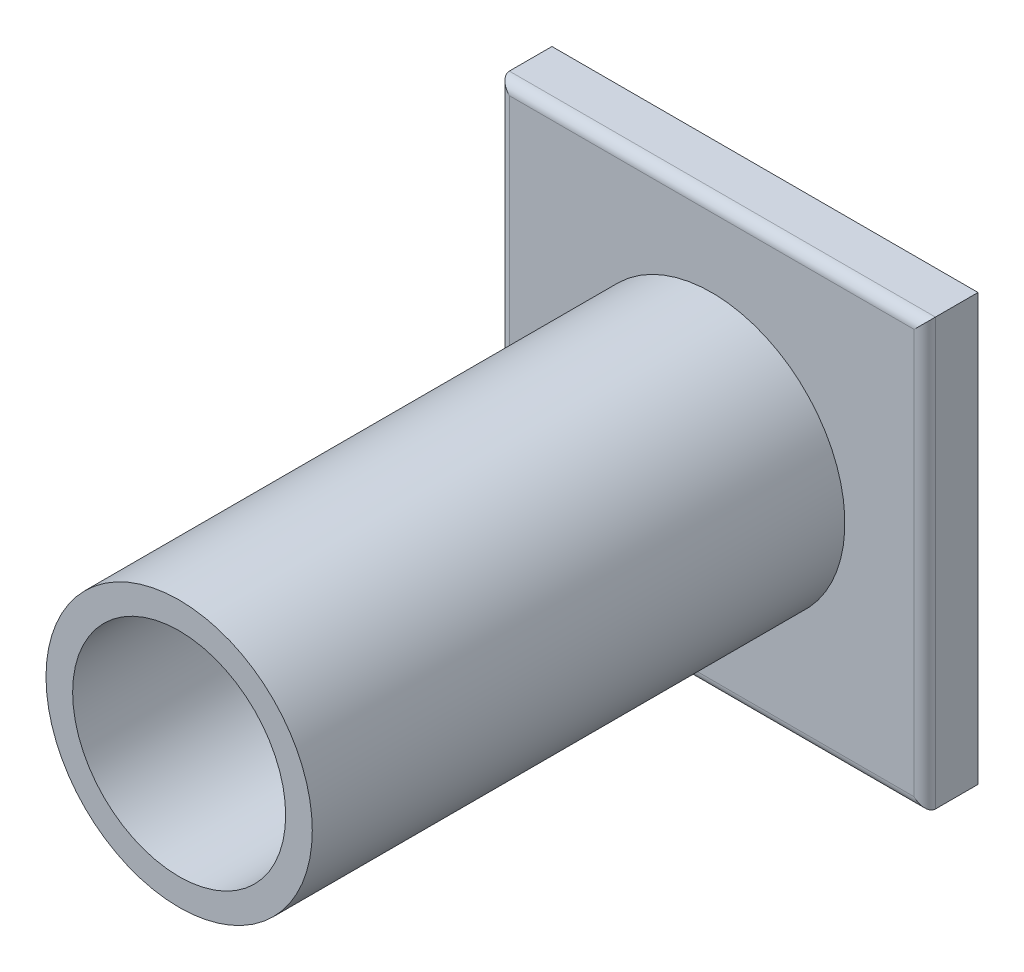
ISO-10303-21;
HEADER;
FILE_DESCRIPTION(('STEP AP214'),'2;1');
FILE_NAME('part.step','',(''),(''),'','','');
FILE_SCHEMA(('AUTOMOTIVE_DESIGN { 1 0 10303 214 1 1 1 1 }'));
ENDSEC;
DATA;
#1=APPLICATION_CONTEXT('core data for automotive mechanical design processes');
#2=APPLICATION_PROTOCOL_DEFINITION('international standard','automotive_design',2000,#1);
#3=PRODUCT_CONTEXT('',#1,'mechanical');
#4=PRODUCT('Part','Part','',(#3));
#5=PRODUCT_RELATED_PRODUCT_CATEGORY('part','',(#4));
#6=PRODUCT_DEFINITION_FORMATION('','',#4);
#7=PRODUCT_DEFINITION_CONTEXT('part definition',#1,'design');
#8=PRODUCT_DEFINITION('design','',#6,#7);
#9=PRODUCT_DEFINITION_SHAPE('','',#8);
#10=(LENGTH_UNIT() NAMED_UNIT(*) SI_UNIT(.MILLI.,.METRE.));
#11=(NAMED_UNIT(*) PLANE_ANGLE_UNIT() SI_UNIT($,.RADIAN.));
#12=(NAMED_UNIT(*) SI_UNIT($,.STERADIAN.) SOLID_ANGLE_UNIT());
#13=UNCERTAINTY_MEASURE_WITH_UNIT(LENGTH_MEASURE(1.E-05),#10,'distance_accuracy_value','');
#14=(GEOMETRIC_REPRESENTATION_CONTEXT(3) GLOBAL_UNCERTAINTY_ASSIGNED_CONTEXT((#13)) GLOBAL_UNIT_ASSIGNED_CONTEXT((#10,
#11,#12)) REPRESENTATION_CONTEXT('',''));
#15=CARTESIAN_POINT('',(0.,0.,0.));
#16=DIRECTION('',(0.,0.,1.));
#17=DIRECTION('',(1.,0.,0.));
#18=AXIS2_PLACEMENT_3D('',#15,#16,#17);
#19=CARTESIAN_POINT('',(400.,-400.,100.));
#20=DIRECTION('',(-1.,0.,0.));
#21=DIRECTION('',(0.,0.,1.));
#22=AXIS2_PLACEMENT_3D('',#19,#20,#21);
#23=PLANE('',#22);
#24=DIRECTION('',(0.,0.,-1.));
#25=VECTOR('',#24,1.);
#26=CARTESIAN_POINT('',(400.,400.,100.));
#27=LINE('',#26,#25);
#28=CARTESIAN_POINT('',(400.,400.,80.));
#29=VERTEX_POINT('',#28);
#30=CARTESIAN_POINT('',(400.,400.,0.));
#31=VERTEX_POINT('',#30);
#32=EDGE_CURVE('E103',#29,#31,#27,.T.);
#33=ORIENTED_EDGE('',*,*,#32,.F.);
#34=DIRECTION('',(0.,1.,0.));
#35=VECTOR('',#34,1.);
#36=CARTESIAN_POINT('',(400.,-400.,80.));
#37=LINE('',#36,#35);
#38=CARTESIAN_POINT('',(400.,-400.,80.));
#39=VERTEX_POINT('',#38);
#40=EDGE_CURVE('E59',#29,#39,#37,.F.);
#41=ORIENTED_EDGE('',*,*,#40,.T.);
#42=DIRECTION('',(0.,0.,-1.));
#43=VECTOR('',#42,1.);
#44=CARTESIAN_POINT('',(400.,-400.,100.));
#45=LINE('',#44,#43);
#46=CARTESIAN_POINT('',(400.,-400.,0.));
#47=VERTEX_POINT('',#46);
#48=EDGE_CURVE('E123',#39,#47,#45,.T.);
#49=ORIENTED_EDGE('',*,*,#48,.T.);
#50=DIRECTION('',(0.,1.,0.));
#51=VECTOR('',#50,1.);
#52=CARTESIAN_POINT('',(400.,-400.,0.));
#53=LINE('',#52,#51);
#54=EDGE_CURVE('E119',#47,#31,#53,.T.);
#55=ORIENTED_EDGE('',*,*,#54,.T.);
#56=EDGE_LOOP('',(#33,#41,#49,#55));
#57=FACE_BOUND('',#56,.T.);
#58=ADVANCED_FACE('F50',(#57),#23,.F.);
#59=CARTESIAN_POINT('',(-400.,400.,100.));
#60=DIRECTION('',(0.,-1.,0.));
#61=DIRECTION('',(0.,0.,-1.));
#62=AXIS2_PLACEMENT_3D('',#59,#60,#61);
#63=PLANE('',#62);
#64=DIRECTION('',(0.,0.,-1.));
#65=VECTOR('',#64,1.);
#66=CARTESIAN_POINT('',(-400.,400.,100.));
#67=LINE('',#66,#65);
#68=CARTESIAN_POINT('',(-400.,400.,80.));
#69=VERTEX_POINT('',#68);
#70=CARTESIAN_POINT('',(-400.,400.,0.));
#71=VERTEX_POINT('',#70);
#72=EDGE_CURVE('E113',#69,#71,#67,.T.);
#73=ORIENTED_EDGE('',*,*,#72,.F.);
#74=DIRECTION('',(-1.,0.,0.));
#75=VECTOR('',#74,1.);
#76=CARTESIAN_POINT('',(-400.,400.,80.));
#77=LINE('',#76,#75);
#78=EDGE_CURVE('E110',#69,#29,#77,.F.);
#79=ORIENTED_EDGE('',*,*,#78,.T.);
#80=ORIENTED_EDGE('',*,*,#32,.T.);
#81=DIRECTION('',(-1.,0.,0.));
#82=VECTOR('',#81,1.);
#83=CARTESIAN_POINT('',(-400.,400.,0.));
#84=LINE('',#83,#82);
#85=EDGE_CURVE('E107',#31,#71,#84,.T.);
#86=ORIENTED_EDGE('',*,*,#85,.T.);
#87=EDGE_LOOP('',(#73,#79,#80,#86));
#88=FACE_BOUND('',#87,.T.);
#89=ADVANCED_FACE('F106',(#88),#63,.F.);
#90=CARTESIAN_POINT('',(-400.,-400.,100.));
#91=DIRECTION('',(1.,0.,0.));
#92=DIRECTION('',(0.,0.,-1.));
#93=AXIS2_PLACEMENT_3D('',#90,#91,#92);
#94=PLANE('',#93);
#95=DIRECTION('',(0.,0.,-1.));
#96=VECTOR('',#95,1.);
#97=CARTESIAN_POINT('',(-400.,-400.,100.));
#98=LINE('',#97,#96);
#99=CARTESIAN_POINT('',(-400.,-400.,80.));
#100=VERTEX_POINT('',#99);
#101=CARTESIAN_POINT('',(-400.,-400.,0.));
#102=VERTEX_POINT('',#101);
#103=EDGE_CURVE('E136',#100,#102,#98,.T.);
#104=ORIENTED_EDGE('',*,*,#103,.F.);
#105=DIRECTION('',(0.,-1.,0.));
#106=VECTOR('',#105,1.);
#107=CARTESIAN_POINT('',(-400.,-400.,80.));
#108=LINE('',#107,#106);
#109=EDGE_CURVE('E151',#100,#69,#108,.F.);
#110=ORIENTED_EDGE('',*,*,#109,.T.);
#111=ORIENTED_EDGE('',*,*,#72,.T.);
#112=DIRECTION('',(0.,-1.,0.));
#113=VECTOR('',#112,1.);
#114=CARTESIAN_POINT('',(-400.,-400.,0.));
#115=LINE('',#114,#113);
#116=EDGE_CURVE('E121',#71,#102,#115,.T.);
#117=ORIENTED_EDGE('',*,*,#116,.T.);
#118=EDGE_LOOP('',(#104,#110,#111,#117));
#119=FACE_BOUND('',#118,.T.);
#120=ADVANCED_FACE('F197',(#119),#94,.F.);
#121=CARTESIAN_POINT('',(-400.,-400.,100.));
#122=DIRECTION('',(0.,1.,0.));
#123=DIRECTION('',(0.,0.,1.));
#124=AXIS2_PLACEMENT_3D('',#121,#122,#123);
#125=PLANE('',#124);
#126=ORIENTED_EDGE('',*,*,#48,.F.);
#127=DIRECTION('',(1.,0.,0.));
#128=VECTOR('',#127,1.);
#129=CARTESIAN_POINT('',(-400.,-400.,80.));
#130=LINE('',#129,#128);
#131=EDGE_CURVE('E11',#39,#100,#130,.F.);
#132=ORIENTED_EDGE('',*,*,#131,.T.);
#133=ORIENTED_EDGE('',*,*,#103,.T.);
#134=DIRECTION('',(1.,0.,0.));
#135=VECTOR('',#134,1.);
#136=CARTESIAN_POINT('',(-400.,-400.,0.));
#137=LINE('',#136,#135);
#138=EDGE_CURVE('E133',#102,#47,#137,.T.);
#139=ORIENTED_EDGE('',*,*,#138,.T.);
#140=EDGE_LOOP('',(#126,#132,#133,#139));
#141=FACE_BOUND('',#140,.T.);
#142=ADVANCED_FACE('F226',(#141),#125,.F.);
#143=CARTESIAN_POINT('',(0.,0.,100.));
#144=DIRECTION('',(0.,0.,-1.));
#145=DIRECTION('',(-1.,0.,0.));
#146=AXIS2_PLACEMENT_3D('',#143,#144,#145);
#147=PLANE('',#146);
#148=DIRECTION('',(0.,1.,0.));
#149=VECTOR('',#148,1.);
#150=CARTESIAN_POINT('',(380.,0.,100.));
#151=LINE('',#150,#149);
#152=CARTESIAN_POINT('',(380.,-380.,100.));
#153=VERTEX_POINT('',#152);
#154=CARTESIAN_POINT('',(380.,380.,100.));
#155=VERTEX_POINT('',#154);
#156=EDGE_CURVE('E143',#153,#155,#151,.T.);
#157=ORIENTED_EDGE('',*,*,#156,.T.);
#158=DIRECTION('',(-1.,0.,0.));
#159=VECTOR('',#158,1.);
#160=CARTESIAN_POINT('',(0.,380.,100.));
#161=LINE('',#160,#159);
#162=CARTESIAN_POINT('',(-380.,380.,100.));
#163=VERTEX_POINT('',#162);
#164=EDGE_CURVE('E147',#155,#163,#161,.T.);
#165=ORIENTED_EDGE('',*,*,#164,.T.);
#166=DIRECTION('',(0.,-1.,0.));
#167=VECTOR('',#166,1.);
#168=CARTESIAN_POINT('',(-380.,0.,100.));
#169=LINE('',#168,#167);
#170=CARTESIAN_POINT('',(-380.,-380.,100.));
#171=VERTEX_POINT('',#170);
#172=EDGE_CURVE('E145',#163,#171,#169,.T.);
#173=ORIENTED_EDGE('',*,*,#172,.T.);
#174=DIRECTION('',(1.,0.,0.));
#175=VECTOR('',#174,1.);
#176=CARTESIAN_POINT('',(0.,-380.,100.));
#177=LINE('',#176,#175);
#178=EDGE_CURVE('E141',#171,#153,#177,.T.);
#179=ORIENTED_EDGE('',*,*,#178,.T.);
#180=EDGE_LOOP('',(#157,#165,#173,#179));
#181=FACE_BOUND('',#180,.T.);
#182=CARTESIAN_POINT('',(0.,0.,100.));
#183=DIRECTION('',(0.,0.,-1.));
#184=DIRECTION('',(-1.,0.,0.));
#185=AXIS2_PLACEMENT_3D('',#182,#183,#184);
#186=CIRCLE('',#185,250.);
#187=CARTESIAN_POINT('',(-250.,0.,100.));
#188=VERTEX_POINT('',#187);
#189=EDGE_CURVE('E112',#188,#188,#186,.F.);
#190=ORIENTED_EDGE('',*,*,#189,.F.);
#191=EDGE_LOOP('',(#190));
#192=FACE_BOUND('',#191,.T.);
#193=ADVANCED_FACE('F189',(#181,#192),#147,.F.);
#194=CARTESIAN_POINT('',(0.,0.,0.));
#195=DIRECTION('',(0.,0.,-1.));
#196=DIRECTION('',(-1.,0.,0.));
#197=AXIS2_PLACEMENT_3D('',#194,#195,#196);
#198=PLANE('',#197);
#199=ORIENTED_EDGE('',*,*,#54,.F.);
#200=ORIENTED_EDGE('',*,*,#138,.F.);
#201=ORIENTED_EDGE('',*,*,#116,.F.);
#202=ORIENTED_EDGE('',*,*,#85,.F.);
#203=EDGE_LOOP('',(#199,#200,#201,#202));
#204=FACE_BOUND('',#203,.T.);
#205=ADVANCED_FACE('F117',(#204),#198,.T.);
#206=CARTESIAN_POINT('',(0.,0.,1100.));
#207=DIRECTION('',(0.,0.,1.));
#208=DIRECTION('',(1.,0.,0.));
#209=AXIS2_PLACEMENT_3D('',#206,#207,#208);
#210=PLANE('',#209);
#211=CARTESIAN_POINT('',(0.,0.,1100.));
#212=DIRECTION('',(0.,0.,1.));
#213=DIRECTION('',(1.,0.,0.));
#214=AXIS2_PLACEMENT_3D('',#211,#212,#213);
#215=CIRCLE('',#214,250.);
#216=CARTESIAN_POINT('',(250.,0.,1100.));
#217=VERTEX_POINT('',#216);
#218=EDGE_CURVE('E125',#217,#217,#215,.T.);
#219=ORIENTED_EDGE('',*,*,#218,.T.);
#220=EDGE_LOOP('',(#219));
#221=FACE_BOUND('',#220,.T.);
#222=CARTESIAN_POINT('',(0.,0.,1100.));
#223=DIRECTION('',(0.,0.,1.));
#224=DIRECTION('',(1.,0.,0.));
#225=AXIS2_PLACEMENT_3D('',#222,#223,#224);
#226=CIRCLE('',#225,200.);
#227=CARTESIAN_POINT('',(200.,0.,1100.));
#228=VERTEX_POINT('',#227);
#229=EDGE_CURVE('E128',#228,#228,#226,.T.);
#230=ORIENTED_EDGE('',*,*,#229,.F.);
#231=EDGE_LOOP('',(#230));
#232=FACE_BOUND('',#231,.T.);
#233=ADVANCED_FACE('F178',(#221,#232),#210,.T.);
#234=CARTESIAN_POINT('',(0.,0.,1100.));
#235=DIRECTION('',(0.,0.,-1.));
#236=DIRECTION('',(-1.,0.,0.));
#237=AXIS2_PLACEMENT_3D('',#234,#235,#236);
#238=CYLINDRICAL_SURFACE('',#237,250.);
#239=ORIENTED_EDGE('',*,*,#218,.F.);
#240=EDGE_LOOP('',(#239));
#241=FACE_BOUND('',#240,.T.);
#242=ORIENTED_EDGE('',*,*,#189,.T.);
#243=EDGE_LOOP('',(#242));
#244=FACE_BOUND('',#243,.T.);
#245=ADVANCED_FACE('F180',(#241,#244),#238,.T.);
#246=CARTESIAN_POINT('',(0.,0.,1100.));
#247=DIRECTION('',(0.,0.,-1.));
#248=DIRECTION('',(-1.,0.,0.));
#249=AXIS2_PLACEMENT_3D('',#246,#247,#248);
#250=CYLINDRICAL_SURFACE('',#249,200.);
#251=ORIENTED_EDGE('',*,*,#229,.T.);
#252=EDGE_LOOP('',(#251));
#253=FACE_BOUND('',#252,.T.);
#254=CARTESIAN_POINT('',(0.,0.,100.));
#255=DIRECTION('',(0.,0.,1.));
#256=DIRECTION('',(1.,0.,0.));
#257=AXIS2_PLACEMENT_3D('',#254,#255,#256);
#258=CIRCLE('',#257,200.);
#259=CARTESIAN_POINT('',(200.,0.,100.));
#260=VERTEX_POINT('',#259);
#261=EDGE_CURVE('E164',#260,#260,#258,.T.);
#262=ORIENTED_EDGE('',*,*,#261,.F.);
#263=EDGE_LOOP('',(#262));
#264=FACE_BOUND('',#263,.T.);
#265=ADVANCED_FACE('F175',(#253,#264),#250,.F.);
#266=ORIENTED_EDGE('',*,*,#261,.T.);
#267=EDGE_LOOP('',(#266));
#268=FACE_BOUND('',#267,.T.);
#269=ADVANCED_FACE('F212',(#268),#147,.F.);
#270=CARTESIAN_POINT('',(0.,-380.,80.));
#271=DIRECTION('',(1.,0.,0.));
#272=DIRECTION('',(0.,0.,-1.));
#273=AXIS2_PLACEMENT_3D('',#270,#271,#272);
#274=CYLINDRICAL_SURFACE('',#273,20.);
#275=CARTESIAN_POINT('',(-380.,-380.,80.));
#276=DIRECTION('',(0.707106781186547,-0.707106781186547,0.));
#277=DIRECTION('',(0.707106781186547,0.707106781186547,0.));
#278=AXIS2_PLACEMENT_3D('',#275,#276,#277);
#279=ELLIPSE('',#278,28.2842712474619,20.);
#280=EDGE_CURVE('E157',#100,#171,#279,.F.);
#281=ORIENTED_EDGE('',*,*,#280,.F.);
#282=ORIENTED_EDGE('',*,*,#131,.F.);
#283=CARTESIAN_POINT('',(380.,-380.,80.));
#284=DIRECTION('',(0.707106781186547,0.707106781186547,0.));
#285=DIRECTION('',(0.707106781186547,-0.707106781186547,0.));
#286=AXIS2_PLACEMENT_3D('',#283,#284,#285);
#287=ELLIPSE('',#286,28.2842712474619,20.);
#288=EDGE_CURVE('E54',#153,#39,#287,.T.);
#289=ORIENTED_EDGE('',*,*,#288,.F.);
#290=ORIENTED_EDGE('',*,*,#178,.F.);
#291=EDGE_LOOP('',(#281,#282,#289,#290));
#292=FACE_BOUND('',#291,.T.);
#293=ADVANCED_FACE('F52',(#292),#274,.T.);
#294=CARTESIAN_POINT('',(380.,0.,80.));
#295=DIRECTION('',(0.,1.,0.));
#296=DIRECTION('',(0.,0.,1.));
#297=AXIS2_PLACEMENT_3D('',#294,#295,#296);
#298=CYLINDRICAL_SURFACE('',#297,20.);
#299=ORIENTED_EDGE('',*,*,#288,.T.);
#300=ORIENTED_EDGE('',*,*,#40,.F.);
#301=CARTESIAN_POINT('',(380.,380.,80.));
#302=DIRECTION('',(-0.707106781186547,0.707106781186547,0.));
#303=DIRECTION('',(0.707106781186547,0.707106781186547,0.));
#304=AXIS2_PLACEMENT_3D('',#301,#302,#303);
#305=ELLIPSE('',#304,28.2842712474619,20.);
#306=EDGE_CURVE('E156',#155,#29,#305,.T.);
#307=ORIENTED_EDGE('',*,*,#306,.F.);
#308=ORIENTED_EDGE('',*,*,#156,.F.);
#309=EDGE_LOOP('',(#299,#300,#307,#308));
#310=FACE_BOUND('',#309,.T.);
#311=ADVANCED_FACE('F207',(#310),#298,.T.);
#312=CARTESIAN_POINT('',(-380.,0.,80.));
#313=DIRECTION('',(0.,-1.,0.));
#314=DIRECTION('',(0.,0.,-1.));
#315=AXIS2_PLACEMENT_3D('',#312,#313,#314);
#316=CYLINDRICAL_SURFACE('',#315,20.);
#317=ORIENTED_EDGE('',*,*,#280,.T.);
#318=ORIENTED_EDGE('',*,*,#172,.F.);
#319=CARTESIAN_POINT('',(-380.,380.,80.));
#320=DIRECTION('',(-0.707106781186547,-0.707106781186547,0.));
#321=DIRECTION('',(0.707106781186547,-0.707106781186547,0.));
#322=AXIS2_PLACEMENT_3D('',#319,#320,#321);
#323=ELLIPSE('',#322,28.2842712474619,20.);
#324=EDGE_CURVE('E154',#69,#163,#323,.F.);
#325=ORIENTED_EDGE('',*,*,#324,.F.);
#326=ORIENTED_EDGE('',*,*,#109,.F.);
#327=EDGE_LOOP('',(#317,#318,#325,#326));
#328=FACE_BOUND('',#327,.T.);
#329=ADVANCED_FACE('F204',(#328),#316,.T.);
#330=CARTESIAN_POINT('',(0.,380.,80.));
#331=DIRECTION('',(-1.,0.,0.));
#332=DIRECTION('',(0.,0.,1.));
#333=AXIS2_PLACEMENT_3D('',#330,#331,#332);
#334=CYLINDRICAL_SURFACE('',#333,20.);
#335=ORIENTED_EDGE('',*,*,#306,.T.);
#336=ORIENTED_EDGE('',*,*,#78,.F.);
#337=ORIENTED_EDGE('',*,*,#324,.T.);
#338=ORIENTED_EDGE('',*,*,#164,.F.);
#339=EDGE_LOOP('',(#335,#336,#337,#338));
#340=FACE_BOUND('',#339,.T.);
#341=ADVANCED_FACE('F201',(#340),#334,.T.);
#342=CLOSED_SHELL('',(#58,#89,#120,#142,#193,#205,#233,#245,#265,#269,#293,#311,#329,#341));
#343=MANIFOLD_SOLID_BREP('B2',#342);
#344=ADVANCED_BREP_SHAPE_REPRESENTATION('',(#18,#343),#14);
#345=SHAPE_DEFINITION_REPRESENTATION(#9,#344);
ENDSEC;
END-ISO-10303-21;
